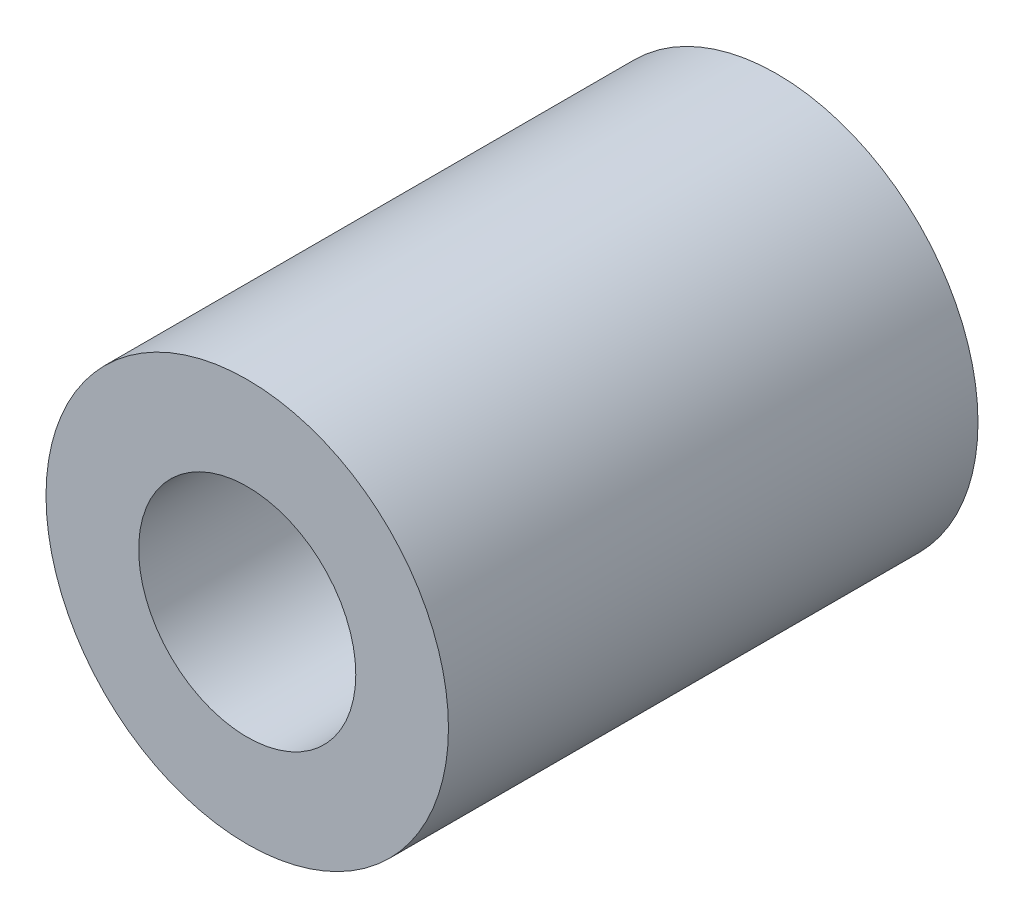
ISO-10303-21;
HEADER;
FILE_DESCRIPTION(('STEP AP214'),'2;1');
FILE_NAME('part.step','',(''),(''),'','','');
FILE_SCHEMA(('AUTOMOTIVE_DESIGN { 1 0 10303 214 1 1 1 1 }'));
ENDSEC;
DATA;
#1=APPLICATION_CONTEXT('core data for automotive mechanical design processes');
#2=APPLICATION_PROTOCOL_DEFINITION('international standard','automotive_design',2000,#1);
#3=PRODUCT_CONTEXT('',#1,'mechanical');
#4=PRODUCT('Part','Part','',(#3));
#5=PRODUCT_RELATED_PRODUCT_CATEGORY('part','',(#4));
#6=PRODUCT_DEFINITION_FORMATION('','',#4);
#7=PRODUCT_DEFINITION_CONTEXT('part definition',#1,'design');
#8=PRODUCT_DEFINITION('design','',#6,#7);
#9=PRODUCT_DEFINITION_SHAPE('','',#8);
#10=(LENGTH_UNIT() NAMED_UNIT(*) SI_UNIT(.MILLI.,.METRE.));
#11=(NAMED_UNIT(*) PLANE_ANGLE_UNIT() SI_UNIT($,.RADIAN.));
#12=(NAMED_UNIT(*) SI_UNIT($,.STERADIAN.) SOLID_ANGLE_UNIT());
#13=UNCERTAINTY_MEASURE_WITH_UNIT(LENGTH_MEASURE(1.E-05),#10,'distance_accuracy_value','');
#14=(GEOMETRIC_REPRESENTATION_CONTEXT(3) GLOBAL_UNCERTAINTY_ASSIGNED_CONTEXT((#13)) GLOBAL_UNIT_ASSIGNED_CONTEXT((#10,
#11,#12)) REPRESENTATION_CONTEXT('',''));
#15=CARTESIAN_POINT('',(0.,0.,0.));
#16=DIRECTION('',(0.,0.,1.));
#17=DIRECTION('',(1.,0.,0.));
#18=AXIS2_PLACEMENT_3D('',#15,#16,#17);
#19=CARTESIAN_POINT('',(0.,0.,25.));
#20=DIRECTION('',(0.,0.,-1.));
#21=DIRECTION('',(-1.,0.,0.));
#22=AXIS2_PLACEMENT_3D('',#19,#20,#21);
#23=CYLINDRICAL_SURFACE('',#22,9.5);
#24=CARTESIAN_POINT('',(0.,0.,25.));
#25=DIRECTION('',(0.,0.,1.));
#26=DIRECTION('',(1.,0.,0.));
#27=AXIS2_PLACEMENT_3D('',#24,#25,#26);
#28=CIRCLE('',#27,9.5);
#29=CARTESIAN_POINT('',(9.5,0.,25.));
#30=VERTEX_POINT('',#29);
#31=EDGE_CURVE('E10',#30,#30,#28,.T.);
#32=ORIENTED_EDGE('',*,*,#31,.F.);
#33=EDGE_LOOP('',(#32));
#34=FACE_BOUND('',#33,.T.);
#35=CARTESIAN_POINT('',(0.,0.,0.));
#36=DIRECTION('',(0.,0.,1.));
#37=DIRECTION('',(1.,0.,0.));
#38=AXIS2_PLACEMENT_3D('',#35,#36,#37);
#39=CIRCLE('',#38,9.5);
#40=CARTESIAN_POINT('',(9.5,0.,0.));
#41=VERTEX_POINT('',#40);
#42=EDGE_CURVE('E41',#41,#41,#39,.T.);
#43=ORIENTED_EDGE('',*,*,#42,.T.);
#44=EDGE_LOOP('',(#43));
#45=FACE_BOUND('',#44,.T.);
#46=ADVANCED_FACE('F34',(#34,#45),#23,.T.);
#47=CARTESIAN_POINT('',(0.,0.,25.));
#48=DIRECTION('',(0.,0.,1.));
#49=DIRECTION('',(1.,0.,0.));
#50=AXIS2_PLACEMENT_3D('',#47,#48,#49);
#51=PLANE('',#50);
#52=CARTESIAN_POINT('',(0.,0.,25.));
#53=DIRECTION('',(0.,0.,1.));
#54=DIRECTION('',(1.,0.,0.));
#55=AXIS2_PLACEMENT_3D('',#52,#53,#54);
#56=CIRCLE('',#55,5.125);
#57=CARTESIAN_POINT('',(5.125,0.,25.));
#58=VERTEX_POINT('',#57);
#59=EDGE_CURVE('E48',#58,#58,#56,.T.);
#60=ORIENTED_EDGE('',*,*,#59,.F.);
#61=EDGE_LOOP('',(#60));
#62=FACE_BOUND('',#61,.T.);
#63=ORIENTED_EDGE('',*,*,#31,.T.);
#64=EDGE_LOOP('',(#63));
#65=FACE_BOUND('',#64,.T.);
#66=ADVANCED_FACE('F75',(#62,#65),#51,.T.);
#67=CARTESIAN_POINT('',(0.,0.,0.));
#68=DIRECTION('',(0.,0.,1.));
#69=DIRECTION('',(1.,0.,0.));
#70=AXIS2_PLACEMENT_3D('',#67,#68,#69);
#71=PLANE('',#70);
#72=CARTESIAN_POINT('',(0.,0.,0.));
#73=DIRECTION('',(0.,0.,-1.));
#74=DIRECTION('',(-1.,0.,0.));
#75=AXIS2_PLACEMENT_3D('',#72,#73,#74);
#76=CIRCLE('',#75,3.125);
#77=CARTESIAN_POINT('',(-3.125,0.,0.));
#78=VERTEX_POINT('',#77);
#79=EDGE_CURVE('E53',#78,#78,#76,.T.);
#80=ORIENTED_EDGE('',*,*,#79,.F.);
#81=EDGE_LOOP('',(#80));
#82=FACE_BOUND('',#81,.T.);
#83=ORIENTED_EDGE('',*,*,#42,.F.);
#84=EDGE_LOOP('',(#83));
#85=FACE_BOUND('',#84,.T.);
#86=ADVANCED_FACE('F71',(#82,#85),#71,.F.);
#87=CARTESIAN_POINT('',(0.,0.,7.));
#88=DIRECTION('',(0.,0.,1.));
#89=DIRECTION('',(1.,0.,0.));
#90=AXIS2_PLACEMENT_3D('',#87,#88,#89);
#91=CYLINDRICAL_SURFACE('',#90,5.125);
#92=CARTESIAN_POINT('',(0.,0.,7.));
#93=DIRECTION('',(0.,0.,1.));
#94=DIRECTION('',(1.,0.,0.));
#95=AXIS2_PLACEMENT_3D('',#92,#93,#94);
#96=CIRCLE('',#95,5.125);
#97=CARTESIAN_POINT('',(5.125,0.,7.));
#98=VERTEX_POINT('',#97);
#99=EDGE_CURVE('E46',#98,#98,#96,.T.);
#100=ORIENTED_EDGE('',*,*,#99,.F.);
#101=EDGE_LOOP('',(#100));
#102=FACE_BOUND('',#101,.T.);
#103=ORIENTED_EDGE('',*,*,#59,.T.);
#104=EDGE_LOOP('',(#103));
#105=FACE_BOUND('',#104,.T.);
#106=ADVANCED_FACE('F65',(#102,#105),#91,.F.);
#107=CARTESIAN_POINT('',(0.,0.,7.));
#108=DIRECTION('',(0.,0.,1.));
#109=DIRECTION('',(1.,0.,0.));
#110=AXIS2_PLACEMENT_3D('',#107,#108,#109);
#111=PLANE('',#110);
#112=CARTESIAN_POINT('',(0.,0.,7.));
#113=DIRECTION('',(0.,0.,1.));
#114=DIRECTION('',(1.,0.,0.));
#115=AXIS2_PLACEMENT_3D('',#112,#113,#114);
#116=CIRCLE('',#115,3.125);
#117=CARTESIAN_POINT('',(3.125,0.,7.));
#118=VERTEX_POINT('',#117);
#119=EDGE_CURVE('E37',#118,#118,#116,.T.);
#120=ORIENTED_EDGE('',*,*,#119,.F.);
#121=EDGE_LOOP('',(#120));
#122=FACE_BOUND('',#121,.T.);
#123=ORIENTED_EDGE('',*,*,#99,.T.);
#124=EDGE_LOOP('',(#123));
#125=FACE_BOUND('',#124,.T.);
#126=ADVANCED_FACE('F62',(#122,#125),#111,.T.);
#127=CARTESIAN_POINT('',(0.,0.,18.));
#128=DIRECTION('',(0.,0.,-1.));
#129=DIRECTION('',(-1.,0.,0.));
#130=AXIS2_PLACEMENT_3D('',#127,#128,#129);
#131=CYLINDRICAL_SURFACE('',#130,3.125);
#132=ORIENTED_EDGE('',*,*,#119,.T.);
#133=EDGE_LOOP('',(#132));
#134=FACE_BOUND('',#133,.T.);
#135=ORIENTED_EDGE('',*,*,#79,.T.);
#136=EDGE_LOOP('',(#135));
#137=FACE_BOUND('',#136,.T.);
#138=ADVANCED_FACE('F60',(#134,#137),#131,.F.);
#139=CLOSED_SHELL('',(#46,#66,#86,#106,#126,#138));
#140=MANIFOLD_SOLID_BREP('B2',#139);
#141=ADVANCED_BREP_SHAPE_REPRESENTATION('',(#18,#140),#14);
#142=SHAPE_DEFINITION_REPRESENTATION(#9,#141);
ENDSEC;
END-ISO-10303-21;
